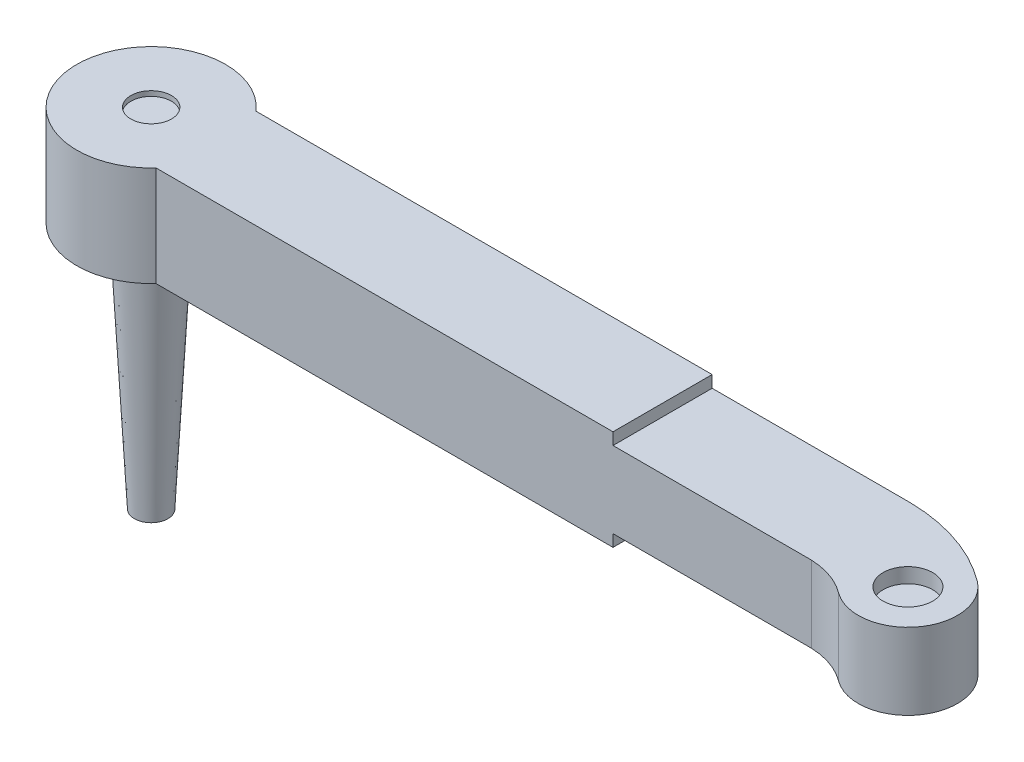
ISO-10303-21;
HEADER;
FILE_DESCRIPTION(('STEP AP214'),'2;1');
FILE_NAME('part.step','',(''),(''),'','','');
FILE_SCHEMA(('AUTOMOTIVE_DESIGN { 1 0 10303 214 1 1 1 1 }'));
ENDSEC;
DATA;
#1=APPLICATION_CONTEXT('core data for automotive mechanical design processes');
#2=APPLICATION_PROTOCOL_DEFINITION('international standard','automotive_design',2000,#1);
#3=PRODUCT_CONTEXT('',#1,'mechanical');
#4=PRODUCT('Part','Part','',(#3));
#5=PRODUCT_RELATED_PRODUCT_CATEGORY('part','',(#4));
#6=PRODUCT_DEFINITION_FORMATION('','',#4);
#7=PRODUCT_DEFINITION_CONTEXT('part definition',#1,'design');
#8=PRODUCT_DEFINITION('design','',#6,#7);
#9=PRODUCT_DEFINITION_SHAPE('','',#8);
#10=(LENGTH_UNIT() NAMED_UNIT(*) SI_UNIT(.MILLI.,.METRE.));
#11=(NAMED_UNIT(*) PLANE_ANGLE_UNIT() SI_UNIT($,.RADIAN.));
#12=(NAMED_UNIT(*) SI_UNIT($,.STERADIAN.) SOLID_ANGLE_UNIT());
#13=UNCERTAINTY_MEASURE_WITH_UNIT(LENGTH_MEASURE(1.E-05),#10,'distance_accuracy_value','');
#14=(GEOMETRIC_REPRESENTATION_CONTEXT(3) GLOBAL_UNCERTAINTY_ASSIGNED_CONTEXT((#13)) GLOBAL_UNIT_ASSIGNED_CONTEXT((#10,
#11,#12)) REPRESENTATION_CONTEXT('',''));
#15=CARTESIAN_POINT('',(0.,0.,0.));
#16=DIRECTION('',(0.,0.,1.));
#17=DIRECTION('',(1.,0.,0.));
#18=AXIS2_PLACEMENT_3D('',#15,#16,#17);
#19=CARTESIAN_POINT('',(-32.9760710821683,10.1,-4.99637440638914));
#20=DIRECTION('',(0.,0.,1.));
#21=DIRECTION('',(1.,0.,0.));
#22=AXIS2_PLACEMENT_3D('',#19,#20,#21);
#23=PLANE('',#22);
#24=DIRECTION('',(-1.,0.,0.));
#25=VECTOR('',#24,1.);
#26=CARTESIAN_POINT('',(-32.9760710821683,10.1,-4.99637440638914));
#27=LINE('',#26,#25);
#28=CARTESIAN_POINT('',(13.0239289178317,10.1,-4.99637440638914));
#29=VERTEX_POINT('',#28);
#30=CARTESIAN_POINT('',(-32.9760710821683,10.1,-4.99637440638914));
#31=VERTEX_POINT('',#30);
#32=EDGE_CURVE('E209',#29,#31,#27,.T.);
#33=ORIENTED_EDGE('',*,*,#32,.F.);
#34=DIRECTION('',(0.,-1.,0.));
#35=VECTOR('',#34,1.);
#36=CARTESIAN_POINT('',(13.0239289178317,10.1,-4.99637440638914));
#37=LINE('',#36,#35);
#38=CARTESIAN_POINT('',(13.0239289178317,8.9,-4.99637440638914));
#39=VERTEX_POINT('',#38);
#40=EDGE_CURVE('E59',#29,#39,#37,.T.);
#41=ORIENTED_EDGE('',*,*,#40,.T.);
#42=DIRECTION('',(1.,0.,0.));
#43=VECTOR('',#42,1.);
#44=CARTESIAN_POINT('',(-32.9760710821683,8.9,-4.99637440638914));
#45=LINE('',#44,#43);
#46=CARTESIAN_POINT('',(33.0239289178317,8.9,-4.99637440638914));
#47=VERTEX_POINT('',#46);
#48=EDGE_CURVE('E196',#39,#47,#45,.T.);
#49=ORIENTED_EDGE('',*,*,#48,.T.);
#50=DIRECTION('',(0.,-1.,0.));
#51=VECTOR('',#50,1.);
#52=CARTESIAN_POINT('',(33.0239289178317,10.1,-4.99637440638914));
#53=LINE('',#52,#51);
#54=CARTESIAN_POINT('',(33.0239289178317,1.2,-4.99637440638914));
#55=VERTEX_POINT('',#54);
#56=EDGE_CURVE('E240',#47,#55,#53,.T.);
#57=ORIENTED_EDGE('',*,*,#56,.T.);
#58=DIRECTION('',(-1.,0.,0.));
#59=VECTOR('',#58,1.);
#60=CARTESIAN_POINT('',(-32.9760710821683,1.2,-4.99637440638914));
#61=LINE('',#60,#59);
#62=CARTESIAN_POINT('',(13.0239289178317,1.2,-4.99637440638914));
#63=VERTEX_POINT('',#62);
#64=EDGE_CURVE('E143',#55,#63,#61,.T.);
#65=ORIENTED_EDGE('',*,*,#64,.T.);
#66=DIRECTION('',(0.,-1.,0.));
#67=VECTOR('',#66,1.);
#68=CARTESIAN_POINT('',(13.0239289178317,10.1,-4.99637440638914));
#69=LINE('',#68,#67);
#70=CARTESIAN_POINT('',(13.0239289178317,0.,-4.99637440638914));
#71=VERTEX_POINT('',#70);
#72=EDGE_CURVE('E180',#63,#71,#69,.T.);
#73=ORIENTED_EDGE('',*,*,#72,.T.);
#74=DIRECTION('',(-1.,0.,0.));
#75=VECTOR('',#74,1.);
#76=CARTESIAN_POINT('',(-32.9760710821683,0.,-4.99637440638914));
#77=LINE('',#76,#75);
#78=CARTESIAN_POINT('',(-32.9760710821683,0.,-4.99637440638914));
#79=VERTEX_POINT('',#78);
#80=EDGE_CURVE('E205',#71,#79,#77,.T.);
#81=ORIENTED_EDGE('',*,*,#80,.T.);
#82=DIRECTION('',(0.,-1.,0.));
#83=VECTOR('',#82,1.);
#84=CARTESIAN_POINT('',(-32.9760710821683,10.1,-4.99637440638914));
#85=LINE('',#84,#83);
#86=EDGE_CURVE('E236',#31,#79,#85,.T.);
#87=ORIENTED_EDGE('',*,*,#86,.F.);
#88=EDGE_LOOP('',(#33,#41,#49,#57,#65,#73,#81,#87));
#89=FACE_BOUND('',#88,.T.);
#90=ADVANCED_FACE('F44',(#89),#23,.F.);
#91=CARTESIAN_POINT('',(-38.6136720149217,10.1,-0.0499154989465598));
#92=DIRECTION('',(0.,-1.,0.));
#93=DIRECTION('',(0.,0.,-1.));
#94=AXIS2_PLACEMENT_3D('',#91,#92,#93);
#95=CYLINDRICAL_SURFACE('',#94,7.5);
#96=CARTESIAN_POINT('',(-38.6136720149217,0.,-0.0499154989465598));
#97=DIRECTION('',(0.,1.,0.));
#98=DIRECTION('',(0.,0.,1.));
#99=AXIS2_PLACEMENT_3D('',#96,#97,#98);
#100=CIRCLE('',#99,7.5);
#101=CARTESIAN_POINT('',(-33.0718562090839,0.,5.00362559361086));
#102=VERTEX_POINT('',#101);
#103=EDGE_CURVE('E223',#79,#102,#100,.T.);
#104=ORIENTED_EDGE('',*,*,#103,.T.);
#105=DIRECTION('',(0.,-1.,0.));
#106=VECTOR('',#105,1.);
#107=CARTESIAN_POINT('',(-33.0718562090839,10.1,5.00362559361086));
#108=LINE('',#107,#106);
#109=CARTESIAN_POINT('',(-33.0718562090839,10.1,5.00362559361086));
#110=VERTEX_POINT('',#109);
#111=EDGE_CURVE('E232',#110,#102,#108,.T.);
#112=ORIENTED_EDGE('',*,*,#111,.F.);
#113=CARTESIAN_POINT('',(-38.6136720149217,10.1,-0.0499154989465598));
#114=DIRECTION('',(0.,1.,0.));
#115=DIRECTION('',(0.,0.,1.));
#116=AXIS2_PLACEMENT_3D('',#113,#114,#115);
#117=CIRCLE('',#116,7.5);
#118=EDGE_CURVE('E212',#31,#110,#117,.T.);
#119=ORIENTED_EDGE('',*,*,#118,.F.);
#120=ORIENTED_EDGE('',*,*,#86,.T.);
#121=EDGE_LOOP('',(#104,#112,#119,#120));
#122=FACE_BOUND('',#121,.T.);
#123=ADVANCED_FACE('F261',(#122),#95,.T.);
#124=CARTESIAN_POINT('',(-33.0718562090839,10.1,5.00362559361086));
#125=DIRECTION('',(0.,0.,-1.));
#126=DIRECTION('',(-1.,0.,0.));
#127=AXIS2_PLACEMENT_3D('',#124,#125,#126);
#128=PLANE('',#127);
#129=DIRECTION('',(1.,0.,0.));
#130=VECTOR('',#129,1.);
#131=CARTESIAN_POINT('',(13.0239289178317,8.9,5.00362559361086));
#132=LINE('',#131,#130);
#133=CARTESIAN_POINT('',(13.0239289178317,8.9,5.00362559361086));
#134=VERTEX_POINT('',#133);
#135=CARTESIAN_POINT('',(33.0239289178317,8.9,5.00362559361086));
#136=VERTEX_POINT('',#135);
#137=EDGE_CURVE('E173',#134,#136,#132,.T.);
#138=ORIENTED_EDGE('',*,*,#137,.F.);
#139=DIRECTION('',(0.,-1.,0.));
#140=VECTOR('',#139,1.);
#141=CARTESIAN_POINT('',(13.0239289178317,10.1,5.00362559361086));
#142=LINE('',#141,#140);
#143=CARTESIAN_POINT('',(13.0239289178317,10.1,5.00362559361086));
#144=VERTEX_POINT('',#143);
#145=EDGE_CURVE('E169',#144,#134,#142,.T.);
#146=ORIENTED_EDGE('',*,*,#145,.F.);
#147=DIRECTION('',(1.,0.,0.));
#148=VECTOR('',#147,1.);
#149=CARTESIAN_POINT('',(-33.0718562090839,10.1,5.00362559361086));
#150=LINE('',#149,#148);
#151=EDGE_CURVE('E216',#110,#144,#150,.T.);
#152=ORIENTED_EDGE('',*,*,#151,.F.);
#153=ORIENTED_EDGE('',*,*,#111,.T.);
#154=DIRECTION('',(1.,0.,0.));
#155=VECTOR('',#154,1.);
#156=CARTESIAN_POINT('',(-33.0718562090839,0.,5.00362559361086));
#157=LINE('',#156,#155);
#158=CARTESIAN_POINT('',(13.0239289178317,0.,5.00362559361086));
#159=VERTEX_POINT('',#158);
#160=EDGE_CURVE('E213',#102,#159,#157,.T.);
#161=ORIENTED_EDGE('',*,*,#160,.T.);
#162=DIRECTION('',(0.,-1.,0.));
#163=VECTOR('',#162,1.);
#164=CARTESIAN_POINT('',(13.0239289178317,0.,5.00362559361086));
#165=LINE('',#164,#163);
#166=CARTESIAN_POINT('',(13.0239289178317,1.2,5.00362559361086));
#167=VERTEX_POINT('',#166);
#168=EDGE_CURVE('E67',#167,#159,#165,.T.);
#169=ORIENTED_EDGE('',*,*,#168,.F.);
#170=DIRECTION('',(-1.,0.,0.));
#171=VECTOR('',#170,1.);
#172=CARTESIAN_POINT('',(13.0239289178317,1.2,5.00362559361086));
#173=LINE('',#172,#171);
#174=CARTESIAN_POINT('',(33.0239289178317,1.2,5.00362559361086));
#175=VERTEX_POINT('',#174);
#176=EDGE_CURVE('E183',#175,#167,#173,.T.);
#177=ORIENTED_EDGE('',*,*,#176,.F.);
#178=DIRECTION('',(0.,-1.,0.));
#179=VECTOR('',#178,1.);
#180=CARTESIAN_POINT('',(33.0239289178317,10.1,5.00362559361086));
#181=LINE('',#180,#179);
#182=EDGE_CURVE('E220',#136,#175,#181,.T.);
#183=ORIENTED_EDGE('',*,*,#182,.F.);
#184=EDGE_LOOP('',(#138,#146,#152,#153,#161,#169,#177,#183));
#185=FACE_BOUND('',#184,.T.);
#186=ADVANCED_FACE('F253',(#185),#128,.F.);
#187=CARTESIAN_POINT('',(-38.6136720149217,10.1,-0.0499154989465598));
#188=DIRECTION('',(0.,1.,0.));
#189=DIRECTION('',(0.,0.,1.));
#190=AXIS2_PLACEMENT_3D('',#187,#188,#189);
#191=PLANE('',#190);
#192=DIRECTION('',(0.,0.,1.));
#193=VECTOR('',#192,1.);
#194=CARTESIAN_POINT('',(13.0239289178317,10.1,-0.0499154989465598));
#195=LINE('',#194,#193);
#196=EDGE_CURVE('E52',#29,#144,#195,.T.);
#197=ORIENTED_EDGE('',*,*,#196,.F.);
#198=ORIENTED_EDGE('',*,*,#32,.T.);
#199=ORIENTED_EDGE('',*,*,#118,.T.);
#200=ORIENTED_EDGE('',*,*,#151,.T.);
#201=EDGE_LOOP('',(#197,#198,#199,#200));
#202=FACE_BOUND('',#201,.T.);
#203=CARTESIAN_POINT('',(-38.6136720149217,10.1,-0.0499154989465598));
#204=DIRECTION('',(0.,1.,0.));
#205=DIRECTION('',(0.,0.,1.));
#206=AXIS2_PLACEMENT_3D('',#203,#204,#205);
#207=CIRCLE('',#206,2.05);
#208=CARTESIAN_POINT('',(-38.6136720149217,10.1,2.00008450105344));
#209=VERTEX_POINT('',#208);
#210=EDGE_CURVE('E200',#209,#209,#207,.T.);
#211=ORIENTED_EDGE('',*,*,#210,.F.);
#212=EDGE_LOOP('',(#211));
#213=FACE_BOUND('',#212,.T.);
#214=ADVANCED_FACE('F255',(#202,#213),#191,.T.);
#215=CARTESIAN_POINT('',(-38.6136720149217,0.,-0.0499154989465598));
#216=DIRECTION('',(0.,1.,0.));
#217=DIRECTION('',(0.,0.,1.));
#218=AXIS2_PLACEMENT_3D('',#215,#216,#217);
#219=PLANE('',#218);
#220=CARTESIAN_POINT('',(-38.6136720149217,0.,-0.0499154989465598));
#221=DIRECTION('',(0.,1.,0.));
#222=DIRECTION('',(0.,0.,1.));
#223=AXIS2_PLACEMENT_3D('',#220,#221,#222);
#224=CIRCLE('',#223,3.);
#225=CARTESIAN_POINT('',(-38.6136720149217,0.,2.95008450105344));
#226=VERTEX_POINT('',#225);
#227=EDGE_CURVE('E11',#226,#226,#224,.F.);
#228=ORIENTED_EDGE('',*,*,#227,.F.);
#229=EDGE_LOOP('',(#228));
#230=FACE_BOUND('',#229,.T.);
#231=ORIENTED_EDGE('',*,*,#80,.F.);
#232=DIRECTION('',(0.,0.,1.));
#233=VECTOR('',#232,1.);
#234=CARTESIAN_POINT('',(13.0239289178317,0.,-0.0499154989465598));
#235=LINE('',#234,#233);
#236=EDGE_CURVE('E243',#71,#159,#235,.T.);
#237=ORIENTED_EDGE('',*,*,#236,.T.);
#238=ORIENTED_EDGE('',*,*,#160,.F.);
#239=ORIENTED_EDGE('',*,*,#103,.F.);
#240=EDGE_LOOP('',(#231,#237,#238,#239));
#241=FACE_BOUND('',#240,.T.);
#242=ADVANCED_FACE('F266',(#230,#241),#219,.F.);
#243=CARTESIAN_POINT('',(-38.6136720149217,9.6,-0.0499154989465598));
#244=DIRECTION('',(0.,1.,0.));
#245=DIRECTION('',(0.,0.,1.));
#246=AXIS2_PLACEMENT_3D('',#243,#244,#245);
#247=CYLINDRICAL_SURFACE('',#246,2.05);
#248=CARTESIAN_POINT('',(-38.6136720149217,9.6,-0.0499154989465598));
#249=DIRECTION('',(0.,1.,0.));
#250=DIRECTION('',(0.,0.,1.));
#251=AXIS2_PLACEMENT_3D('',#248,#249,#250);
#252=CIRCLE('',#251,2.05);
#253=CARTESIAN_POINT('',(-38.6136720149217,9.6,2.00008450105344));
#254=VERTEX_POINT('',#253);
#255=EDGE_CURVE('E201',#254,#254,#252,.T.);
#256=ORIENTED_EDGE('',*,*,#255,.F.);
#257=EDGE_LOOP('',(#256));
#258=FACE_BOUND('',#257,.T.);
#259=ORIENTED_EDGE('',*,*,#210,.T.);
#260=EDGE_LOOP('',(#259));
#261=FACE_BOUND('',#260,.T.);
#262=ADVANCED_FACE('F297',(#258,#261),#247,.F.);
#263=CARTESIAN_POINT('',(-38.6136720149217,9.6,-0.0499154989465598));
#264=DIRECTION('',(0.,1.,0.));
#265=DIRECTION('',(0.,0.,1.));
#266=AXIS2_PLACEMENT_3D('',#263,#264,#265);
#267=PLANE('',#266);
#268=ORIENTED_EDGE('',*,*,#255,.T.);
#269=EDGE_LOOP('',(#268));
#270=FACE_BOUND('',#269,.T.);
#271=ADVANCED_FACE('F302',(#270),#267,.T.);
#272=CARTESIAN_POINT('',(13.0239289178317,1.2,-7.54991549894656));
#273=DIRECTION('',(0.,1.,0.));
#274=DIRECTION('',(0.,0.,1.));
#275=AXIS2_PLACEMENT_3D('',#272,#273,#274);
#276=PLANE('',#275);
#277=CARTESIAN_POINT('',(40.2399011233872,1.2,2.47601316527183));
#278=DIRECTION('',(0.,1.,0.));
#279=DIRECTION('',(0.,0.,1.));
#280=AXIS2_PLACEMENT_3D('',#277,#278,#279);
#281=CIRCLE('',#280,2.5);
#282=CARTESIAN_POINT('',(40.2399011233872,1.2,4.97601316527183));
#283=VERTEX_POINT('',#282);
#284=EDGE_CURVE('E333',#283,#283,#281,.T.);
#285=ORIENTED_EDGE('',*,*,#284,.T.);
#286=EDGE_LOOP('',(#285));
#287=FACE_BOUND('',#286,.T.);
#288=ORIENTED_EDGE('',*,*,#64,.F.);
#289=CARTESIAN_POINT('',(32.7732450717206,1.2,12.5018300046154));
#290=DIRECTION('',(0.,1.,0.));
#291=DIRECTION('',(0.,0.,1.));
#292=AXIS2_PLACEMENT_3D('',#289,#290,#291);
#293=CIRCLE('',#292,17.5);
#294=CARTESIAN_POINT('',(43.3062080760926,1.2,-1.47338700080283));
#295=VERTEX_POINT('',#294);
#296=EDGE_CURVE('E124',#295,#55,#293,.T.);
#297=ORIENTED_EDGE('',*,*,#296,.F.);
#298=CARTESIAN_POINT('',(40.2399011233872,1.2,2.47601316527183));
#299=DIRECTION('',(0.,1.,0.));
#300=DIRECTION('',(0.,0.,1.));
#301=AXIS2_PLACEMENT_3D('',#298,#299,#300);
#302=CIRCLE('',#301,5.);
#303=CARTESIAN_POINT('',(37.3344275489248,1.2,6.54519285018389));
#304=VERTEX_POINT('',#303);
#305=EDGE_CURVE('E139',#304,#295,#302,.T.);
#306=ORIENTED_EDGE('',*,*,#305,.F.);
#307=CARTESIAN_POINT('',(32.7732450717206,1.2,12.5018300046154));
#308=DIRECTION('',(0.,-1.,0.));
#309=DIRECTION('',(0.,0.,1.));
#310=AXIS2_PLACEMENT_3D('',#307,#308,#309);
#311=CIRCLE('',#310,7.50239373666227);
#312=EDGE_CURVE('E134',#175,#304,#311,.T.);
#313=ORIENTED_EDGE('',*,*,#312,.F.);
#314=ORIENTED_EDGE('',*,*,#176,.T.);
#315=DIRECTION('',(0.,0.,1.));
#316=VECTOR('',#315,1.);
#317=CARTESIAN_POINT('',(13.0239289178317,1.2,-7.54991549894656));
#318=LINE('',#317,#316);
#319=EDGE_CURVE('E167',#63,#167,#318,.T.);
#320=ORIENTED_EDGE('',*,*,#319,.F.);
#321=EDGE_LOOP('',(#288,#297,#306,#313,#314,#320));
#322=FACE_BOUND('',#321,.T.);
#323=ADVANCED_FACE('F138',(#287,#322),#276,.F.);
#324=CARTESIAN_POINT('',(13.0239289178317,0.,-7.54991549894656));
#325=DIRECTION('',(-1.,0.,0.));
#326=DIRECTION('',(0.,0.,1.));
#327=AXIS2_PLACEMENT_3D('',#324,#325,#326);
#328=PLANE('',#327);
#329=ORIENTED_EDGE('',*,*,#319,.T.);
#330=ORIENTED_EDGE('',*,*,#168,.T.);
#331=ORIENTED_EDGE('',*,*,#236,.F.);
#332=ORIENTED_EDGE('',*,*,#72,.F.);
#333=EDGE_LOOP('',(#329,#330,#331,#332));
#334=FACE_BOUND('',#333,.T.);
#335=ADVANCED_FACE('F267',(#334),#328,.F.);
#336=CARTESIAN_POINT('',(13.0239289178317,8.9,-7.54991549894656));
#337=DIRECTION('',(0.,-1.,0.));
#338=DIRECTION('',(1.,0.,0.));
#339=AXIS2_PLACEMENT_3D('',#336,#337,#338);
#340=PLANE('',#339);
#341=CARTESIAN_POINT('',(40.2399011233872,8.9,2.47601316527183));
#342=DIRECTION('',(0.,1.,0.));
#343=DIRECTION('',(0.,0.,1.));
#344=AXIS2_PLACEMENT_3D('',#341,#342,#343);
#345=CIRCLE('',#344,2.5);
#346=CARTESIAN_POINT('',(40.2399011233872,8.9,4.97601316527183));
#347=VERTEX_POINT('',#346);
#348=EDGE_CURVE('E155',#347,#347,#345,.T.);
#349=ORIENTED_EDGE('',*,*,#348,.F.);
#350=EDGE_LOOP('',(#349));
#351=FACE_BOUND('',#350,.T.);
#352=DIRECTION('',(0.,0.,1.));
#353=VECTOR('',#352,1.);
#354=CARTESIAN_POINT('',(13.0239289178317,8.9,-7.54991549894656));
#355=LINE('',#354,#353);
#356=EDGE_CURVE('E177',#39,#134,#355,.T.);
#357=ORIENTED_EDGE('',*,*,#356,.T.);
#358=ORIENTED_EDGE('',*,*,#137,.T.);
#359=CARTESIAN_POINT('',(32.7732450717206,8.9,12.5018300046154));
#360=DIRECTION('',(0.,-1.,0.));
#361=DIRECTION('',(0.,0.,1.));
#362=AXIS2_PLACEMENT_3D('',#359,#360,#361);
#363=CIRCLE('',#362,7.50239373666227);
#364=CARTESIAN_POINT('',(37.3344275489248,8.9,6.54519285018389));
#365=VERTEX_POINT('',#364);
#366=EDGE_CURVE('E149',#136,#365,#363,.T.);
#367=ORIENTED_EDGE('',*,*,#366,.T.);
#368=CARTESIAN_POINT('',(40.2399011233872,8.9,2.47601316527183));
#369=DIRECTION('',(0.,1.,0.));
#370=DIRECTION('',(0.,0.,1.));
#371=AXIS2_PLACEMENT_3D('',#368,#369,#370);
#372=CIRCLE('',#371,5.);
#373=CARTESIAN_POINT('',(43.3062080760926,8.9,-1.47338700080283));
#374=VERTEX_POINT('',#373);
#375=EDGE_CURVE('E160',#365,#374,#372,.T.);
#376=ORIENTED_EDGE('',*,*,#375,.T.);
#377=CARTESIAN_POINT('',(32.7732450717206,8.9,12.5018300046154));
#378=DIRECTION('',(0.,1.,0.));
#379=DIRECTION('',(0.,0.,1.));
#380=AXIS2_PLACEMENT_3D('',#377,#378,#379);
#381=CIRCLE('',#380,17.5);
#382=EDGE_CURVE('E127',#374,#47,#381,.T.);
#383=ORIENTED_EDGE('',*,*,#382,.T.);
#384=ORIENTED_EDGE('',*,*,#48,.F.);
#385=EDGE_LOOP('',(#357,#358,#367,#376,#383,#384));
#386=FACE_BOUND('',#385,.T.);
#387=ADVANCED_FACE('F270',(#351,#386),#340,.F.);
#388=CARTESIAN_POINT('',(13.0239289178317,10.1,-7.54991549894656));
#389=DIRECTION('',(-1.,0.,0.));
#390=DIRECTION('',(0.,0.,1.));
#391=AXIS2_PLACEMENT_3D('',#388,#389,#390);
#392=PLANE('',#391);
#393=ORIENTED_EDGE('',*,*,#196,.T.);
#394=ORIENTED_EDGE('',*,*,#145,.T.);
#395=ORIENTED_EDGE('',*,*,#356,.F.);
#396=ORIENTED_EDGE('',*,*,#40,.F.);
#397=EDGE_LOOP('',(#393,#394,#395,#396));
#398=FACE_BOUND('',#397,.T.);
#399=ADVANCED_FACE('F247',(#398),#392,.F.);
#400=CARTESIAN_POINT('',(40.2399011233872,1.2,2.47601316527183));
#401=DIRECTION('',(0.,1.,0.));
#402=DIRECTION('',(0.,0.,1.));
#403=AXIS2_PLACEMENT_3D('',#400,#401,#402);
#404=CYLINDRICAL_SURFACE('',#403,5.);
#405=ORIENTED_EDGE('',*,*,#375,.F.);
#406=DIRECTION('',(0.,1.,0.));
#407=VECTOR('',#406,1.);
#408=CARTESIAN_POINT('',(37.3344275489248,1.2,6.54519285018389));
#409=LINE('',#408,#407);
#410=EDGE_CURVE('E133',#304,#365,#409,.T.);
#411=ORIENTED_EDGE('',*,*,#410,.F.);
#412=ORIENTED_EDGE('',*,*,#305,.T.);
#413=DIRECTION('',(0.,1.,0.));
#414=VECTOR('',#413,1.);
#415=CARTESIAN_POINT('',(43.3062080760926,1.2,-1.47338700080283));
#416=LINE('',#415,#414);
#417=EDGE_CURVE('E121',#295,#374,#416,.T.);
#418=ORIENTED_EDGE('',*,*,#417,.T.);
#419=EDGE_LOOP('',(#405,#411,#412,#418));
#420=FACE_BOUND('',#419,.T.);
#421=ADVANCED_FACE('F147',(#420),#404,.T.);
#422=CARTESIAN_POINT('',(32.7732450717206,1.2,12.5018300046154));
#423=DIRECTION('',(0.,1.,0.));
#424=DIRECTION('',(0.,0.,1.));
#425=AXIS2_PLACEMENT_3D('',#422,#423,#424);
#426=CYLINDRICAL_SURFACE('',#425,7.50239373666227);
#427=ORIENTED_EDGE('',*,*,#366,.F.);
#428=ORIENTED_EDGE('',*,*,#182,.T.);
#429=ORIENTED_EDGE('',*,*,#312,.T.);
#430=ORIENTED_EDGE('',*,*,#410,.T.);
#431=EDGE_LOOP('',(#427,#428,#429,#430));
#432=FACE_BOUND('',#431,.T.);
#433=ADVANCED_FACE('F272',(#432),#426,.F.);
#434=CARTESIAN_POINT('',(32.7732450717206,1.2,12.5018300046154));
#435=DIRECTION('',(0.,1.,0.));
#436=DIRECTION('',(0.,0.,1.));
#437=AXIS2_PLACEMENT_3D('',#434,#435,#436);
#438=CYLINDRICAL_SURFACE('',#437,17.5);
#439=ORIENTED_EDGE('',*,*,#382,.F.);
#440=ORIENTED_EDGE('',*,*,#417,.F.);
#441=ORIENTED_EDGE('',*,*,#296,.T.);
#442=ORIENTED_EDGE('',*,*,#56,.F.);
#443=EDGE_LOOP('',(#439,#440,#441,#442));
#444=FACE_BOUND('',#443,.T.);
#445=ADVANCED_FACE('F123',(#444),#438,.T.);
#446=CARTESIAN_POINT('',(40.2399011233872,7.4,2.47601316527183));
#447=DIRECTION('',(0.,1.,0.));
#448=DIRECTION('',(0.,0.,1.));
#449=AXIS2_PLACEMENT_3D('',#446,#447,#448);
#450=CYLINDRICAL_SURFACE('',#449,2.5);
#451=CARTESIAN_POINT('',(40.2399011233872,7.4,2.47601316527183));
#452=DIRECTION('',(0.,1.,0.));
#453=DIRECTION('',(0.,0.,1.));
#454=AXIS2_PLACEMENT_3D('',#451,#452,#453);
#455=CIRCLE('',#454,2.5);
#456=CARTESIAN_POINT('',(40.2399011233872,7.4,4.97601316527183));
#457=VERTEX_POINT('',#456);
#458=EDGE_CURVE('E163',#457,#457,#455,.T.);
#459=ORIENTED_EDGE('',*,*,#458,.F.);
#460=EDGE_LOOP('',(#459));
#461=FACE_BOUND('',#460,.T.);
#462=ORIENTED_EDGE('',*,*,#348,.T.);
#463=EDGE_LOOP('',(#462));
#464=FACE_BOUND('',#463,.T.);
#465=ADVANCED_FACE('F280',(#461,#464),#450,.F.);
#466=CARTESIAN_POINT('',(40.2399011233872,7.4,2.47601316527183));
#467=DIRECTION('',(0.,1.,0.));
#468=DIRECTION('',(0.,0.,1.));
#469=AXIS2_PLACEMENT_3D('',#466,#467,#468);
#470=PLANE('',#469);
#471=ORIENTED_EDGE('',*,*,#458,.T.);
#472=EDGE_LOOP('',(#471));
#473=FACE_BOUND('',#472,.T.);
#474=ADVANCED_FACE('F357',(#473),#470,.T.);
#475=CARTESIAN_POINT('',(-38.6136720149217,0.,-0.0499154989465598));
#476=DIRECTION('',(0.,1.,0.));
#477=DIRECTION('',(0.,0.,-1.));
#478=AXIS2_PLACEMENT_3D('',#475,#476,#477);
#479=CONICAL_SURFACE('',#478,3.,0.05235987755983);
#480=CARTESIAN_POINT('',(-38.6136720149217,-25.,-0.0499154989465598));
#481=DIRECTION('',(0.,-1.,0.));
#482=DIRECTION('',(0.,0.,-1.));
#483=AXIS2_PLACEMENT_3D('',#480,#481,#482);
#484=CIRCLE('',#483,1.68980551792397);
#485=CARTESIAN_POINT('',(-38.6136720149217,-25.,-1.73972101687053));
#486=VERTEX_POINT('',#485);
#487=EDGE_CURVE('E322',#486,#486,#484,.T.);
#488=ORIENTED_EDGE('',*,*,#487,.F.);
#489=EDGE_LOOP('',(#488));
#490=FACE_BOUND('',#489,.T.);
#491=ORIENTED_EDGE('',*,*,#227,.T.);
#492=EDGE_LOOP('',(#491));
#493=FACE_BOUND('',#492,.T.);
#494=ADVANCED_FACE('F352',(#490,#493),#479,.T.);
#495=CARTESIAN_POINT('',(-38.6136720149217,-25.,-0.0499154989465598));
#496=DIRECTION('',(0.,-1.,0.));
#497=DIRECTION('',(0.,0.,-1.));
#498=AXIS2_PLACEMENT_3D('',#495,#496,#497);
#499=PLANE('',#498);
#500=ORIENTED_EDGE('',*,*,#487,.T.);
#501=EDGE_LOOP('',(#500));
#502=FACE_BOUND('',#501,.T.);
#503=ADVANCED_FACE('F343',(#502),#499,.T.);
#504=CARTESIAN_POINT('',(40.2399011233872,2.7,2.47601316527183));
#505=DIRECTION('',(0.,-1.,0.));
#506=DIRECTION('',(0.,0.,-1.));
#507=AXIS2_PLACEMENT_3D('',#504,#505,#506);
#508=CYLINDRICAL_SURFACE('',#507,2.5);
#509=CARTESIAN_POINT('',(40.2399011233872,2.7,2.47601316527183));
#510=DIRECTION('',(0.,1.,0.));
#511=DIRECTION('',(0.,0.,1.));
#512=AXIS2_PLACEMENT_3D('',#509,#510,#511);
#513=CIRCLE('',#512,2.5);
#514=CARTESIAN_POINT('',(40.2399011233872,2.7,4.97601316527183));
#515=VERTEX_POINT('',#514);
#516=EDGE_CURVE('E327',#515,#515,#513,.T.);
#517=ORIENTED_EDGE('',*,*,#516,.T.);
#518=EDGE_LOOP('',(#517));
#519=FACE_BOUND('',#518,.T.);
#520=ORIENTED_EDGE('',*,*,#284,.F.);
#521=EDGE_LOOP('',(#520));
#522=FACE_BOUND('',#521,.T.);
#523=ADVANCED_FACE('F340',(#519,#522),#508,.F.);
#524=CARTESIAN_POINT('',(40.2399011233872,2.7,2.47601316527183));
#525=DIRECTION('',(0.,-1.,0.));
#526=DIRECTION('',(0.,0.,1.));
#527=AXIS2_PLACEMENT_3D('',#524,#525,#526);
#528=PLANE('',#527);
#529=ORIENTED_EDGE('',*,*,#516,.F.);
#530=EDGE_LOOP('',(#529));
#531=FACE_BOUND('',#530,.T.);
#532=ADVANCED_FACE('F342',(#531),#528,.T.);
#533=CLOSED_SHELL('',(#90,#123,#186,#214,#242,#262,#271,#323,#335,#387,#399,#421,#433,#445,#465,
#474,#494,#503,#523,#532));
#534=MANIFOLD_SOLID_BREP('B2',#533);
#535=ADVANCED_BREP_SHAPE_REPRESENTATION('',(#18,#534),#14);
#536=SHAPE_DEFINITION_REPRESENTATION(#9,#535);
ENDSEC;
END-ISO-10303-21;
